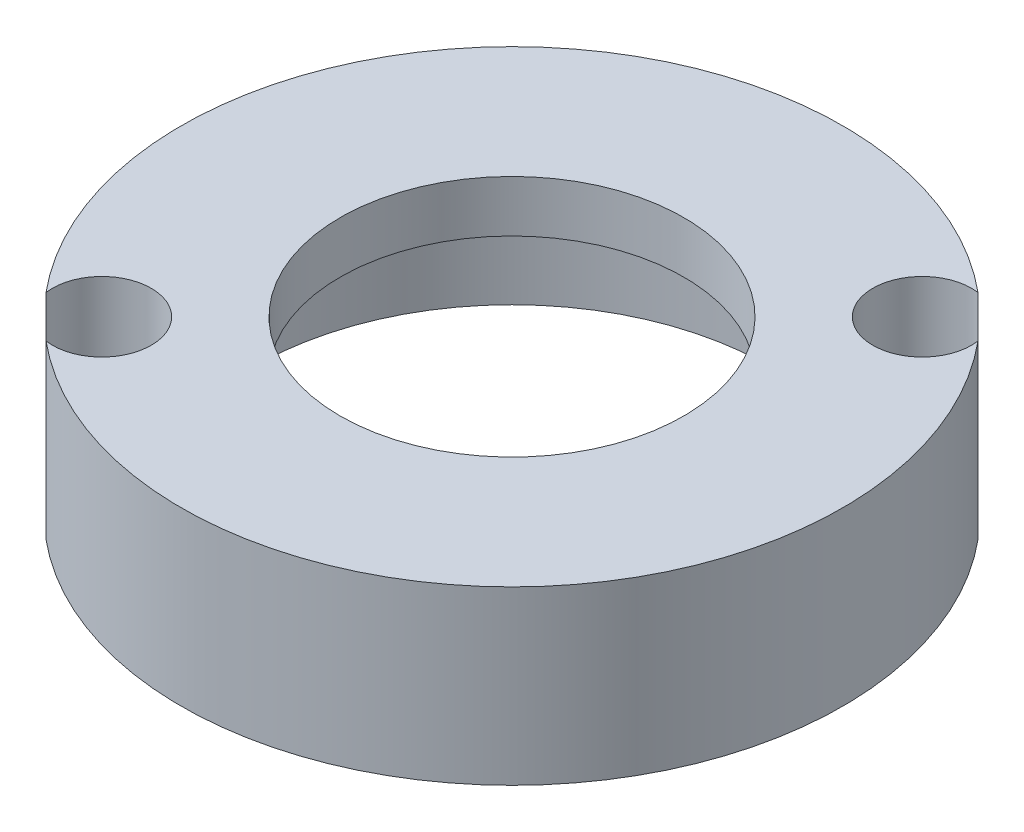
ISO-10303-21;
HEADER;
FILE_DESCRIPTION(('STEP AP214'),'2;1');
FILE_NAME('part.step','',(''),(''),'','','');
FILE_SCHEMA(('AUTOMOTIVE_DESIGN { 1 0 10303 214 1 1 1 1 }'));
ENDSEC;
DATA;
#1=APPLICATION_CONTEXT('core data for automotive mechanical design processes');
#2=APPLICATION_PROTOCOL_DEFINITION('international standard','automotive_design',2000,#1);
#3=PRODUCT_CONTEXT('',#1,'mechanical');
#4=PRODUCT('Part','Part','',(#3));
#5=PRODUCT_RELATED_PRODUCT_CATEGORY('part','',(#4));
#6=PRODUCT_DEFINITION_FORMATION('','',#4);
#7=PRODUCT_DEFINITION_CONTEXT('part definition',#1,'design');
#8=PRODUCT_DEFINITION('design','',#6,#7);
#9=PRODUCT_DEFINITION_SHAPE('','',#8);
#10=(LENGTH_UNIT() NAMED_UNIT(*) SI_UNIT(.MILLI.,.METRE.));
#11=(NAMED_UNIT(*) PLANE_ANGLE_UNIT() SI_UNIT($,.RADIAN.));
#12=(NAMED_UNIT(*) SI_UNIT($,.STERADIAN.) SOLID_ANGLE_UNIT());
#13=UNCERTAINTY_MEASURE_WITH_UNIT(LENGTH_MEASURE(1.E-05),#10,'distance_accuracy_value','');
#14=(GEOMETRIC_REPRESENTATION_CONTEXT(3) GLOBAL_UNCERTAINTY_ASSIGNED_CONTEXT((#13)) GLOBAL_UNIT_ASSIGNED_CONTEXT((#10,
#11,#12)) REPRESENTATION_CONTEXT('',''));
#15=CARTESIAN_POINT('',(0.,0.,0.));
#16=DIRECTION('',(0.,0.,1.));
#17=DIRECTION('',(1.,0.,0.));
#18=AXIS2_PLACEMENT_3D('',#15,#16,#17);
#19=CARTESIAN_POINT('',(0.,0.,0.));
#20=DIRECTION('',(0.,1.,0.));
#21=DIRECTION('',(0.,0.,1.));
#22=AXIS2_PLACEMENT_3D('',#19,#20,#21);
#23=PLANE('',#22);
#24=CARTESIAN_POINT('',(0.,0.,0.));
#25=DIRECTION('',(0.,-1.,0.));
#26=DIRECTION('',(0.,0.,-1.));
#27=AXIS2_PLACEMENT_3D('',#24,#25,#26);
#28=CIRCLE('',#27,6.);
#29=CARTESIAN_POINT('',(4.78265484035535,0.,-3.62301154814963));
#30=VERTEX_POINT('',#29);
#31=CARTESIAN_POINT('',(-3.62301154814961,0.,4.78265484035536));
#32=VERTEX_POINT('',#31);
#33=EDGE_CURVE('E112',#30,#32,#28,.T.);
#34=ORIENTED_EDGE('',*,*,#33,.F.);
#35=CARTESIAN_POINT('',(4.77297077300918,0.,-4.77297077300921));
#36=DIRECTION('',(0.,1.,0.));
#37=DIRECTION('',(0.,0.,1.));
#38=AXIS2_PLACEMENT_3D('',#35,#36,#37);
#39=CIRCLE('',#38,1.15);
#40=CARTESIAN_POINT('',(5.91167282869287,0.,-4.93377384630613));
#41=VERTEX_POINT('',#40);
#42=EDGE_CURVE('E150',#30,#41,#39,.T.);
#43=ORIENTED_EDGE('',*,*,#42,.T.);
#44=CARTESIAN_POINT('',(0.,0.,0.));
#45=DIRECTION('',(0.,1.,0.));
#46=DIRECTION('',(0.,0.,1.));
#47=AXIS2_PLACEMENT_3D('',#44,#45,#46);
#48=CIRCLE('',#47,7.7);
#49=CARTESIAN_POINT('',(-4.93377384630611,0.,5.9116728286929));
#50=VERTEX_POINT('',#49);
#51=EDGE_CURVE('E114',#50,#41,#48,.T.);
#52=ORIENTED_EDGE('',*,*,#51,.F.);
#53=CARTESIAN_POINT('',(-4.77297077300919,0.,4.7729707730092));
#54=DIRECTION('',(0.,1.,0.));
#55=DIRECTION('',(0.,0.,1.));
#56=AXIS2_PLACEMENT_3D('',#53,#54,#55);
#57=CIRCLE('',#56,1.15);
#58=EDGE_CURVE('E99',#50,#32,#57,.T.);
#59=ORIENTED_EDGE('',*,*,#58,.T.);
#60=EDGE_LOOP('',(#34,#43,#52,#59));
#61=FACE_BOUND('',#60,.T.);
#62=ADVANCED_FACE('F34',(#61),#23,.F.);
#63=CARTESIAN_POINT('',(0.,4.,0.));
#64=DIRECTION('',(0.,-1.,0.));
#65=DIRECTION('',(0.,0.,-1.));
#66=AXIS2_PLACEMENT_3D('',#63,#64,#65);
#67=CYLINDRICAL_SURFACE('',#66,7.7);
#68=ORIENTED_EDGE('',*,*,#51,.T.);
#69=DIRECTION('',(0.,1.,0.));
#70=VECTOR('',#69,1.);
#71=CARTESIAN_POINT('',(5.91167282869287,2.,-4.93377384630614));
#72=LINE('',#71,#70);
#73=CARTESIAN_POINT('',(5.91167282869287,4.,-4.93377384630613));
#74=VERTEX_POINT('',#73);
#75=EDGE_CURVE('E125',#41,#74,#72,.T.);
#76=ORIENTED_EDGE('',*,*,#75,.T.);
#77=CARTESIAN_POINT('',(0.,4.,0.));
#78=DIRECTION('',(0.,1.,0.));
#79=DIRECTION('',(0.,0.,1.));
#80=AXIS2_PLACEMENT_3D('',#77,#78,#79);
#81=CIRCLE('',#80,7.7);
#82=CARTESIAN_POINT('',(-4.93377384630611,4.,5.9116728286929));
#83=VERTEX_POINT('',#82);
#84=EDGE_CURVE('E133',#83,#74,#81,.T.);
#85=ORIENTED_EDGE('',*,*,#84,.F.);
#86=DIRECTION('',(0.,1.,0.));
#87=VECTOR('',#86,1.);
#88=CARTESIAN_POINT('',(-4.93377384630611,2.,5.9116728286929));
#89=LINE('',#88,#87);
#90=EDGE_CURVE('E149',#83,#50,#89,.F.);
#91=ORIENTED_EDGE('',*,*,#90,.T.);
#92=EDGE_LOOP('',(#68,#76,#85,#91));
#93=FACE_BOUND('',#92,.T.);
#94=ADVANCED_FACE('F169',(#93),#67,.T.);
#95=CARTESIAN_POINT('',(0.,20.9705627484771,0.));
#96=DIRECTION('',(0.,-1.,0.));
#97=DIRECTION('',(0.,0.,-1.));
#98=AXIS2_PLACEMENT_3D('',#95,#96,#97);
#99=CYLINDRICAL_SURFACE('',#98,6.);
#100=CARTESIAN_POINT('',(0.,2.8,0.));
#101=DIRECTION('',(0.,1.,0.));
#102=DIRECTION('',(0.,0.,1.));
#103=AXIS2_PLACEMENT_3D('',#100,#101,#102);
#104=CIRCLE('',#103,6.);
#105=CARTESIAN_POINT('',(4.78265484035535,2.8,-3.62301154814963));
#106=VERTEX_POINT('',#105);
#107=CARTESIAN_POINT('',(-3.62301154814961,2.8,4.78265484035536));
#108=VERTEX_POINT('',#107);
#109=EDGE_CURVE('E119',#106,#108,#104,.F.);
#110=ORIENTED_EDGE('',*,*,#109,.F.);
#111=DIRECTION('',(0.,1.,0.));
#112=VECTOR('',#111,1.);
#113=CARTESIAN_POINT('',(4.78265484035535,2.,-3.62301154814963));
#114=LINE('',#113,#112);
#115=EDGE_CURVE('E12',#106,#30,#114,.F.);
#116=ORIENTED_EDGE('',*,*,#115,.T.);
#117=ORIENTED_EDGE('',*,*,#33,.T.);
#118=DIRECTION('',(0.,1.,0.));
#119=VECTOR('',#118,1.);
#120=CARTESIAN_POINT('',(-3.62301154814961,2.,4.78265484035536));
#121=LINE('',#120,#119);
#122=EDGE_CURVE('E96',#32,#108,#121,.T.);
#123=ORIENTED_EDGE('',*,*,#122,.T.);
#124=EDGE_LOOP('',(#110,#116,#117,#123));
#125=FACE_BOUND('',#124,.T.);
#126=ADVANCED_FACE('F118',(#125),#99,.F.);
#127=CARTESIAN_POINT('',(0.,4.,0.));
#128=DIRECTION('',(0.,1.,0.));
#129=DIRECTION('',(0.,0.,1.));
#130=AXIS2_PLACEMENT_3D('',#127,#128,#129);
#131=PLANE('',#130);
#132=CARTESIAN_POINT('',(4.77297077300918,4.,-4.77297077300921));
#133=DIRECTION('',(0.,1.,0.));
#134=DIRECTION('',(0.,0.,1.));
#135=AXIS2_PLACEMENT_3D('',#132,#133,#134);
#136=CIRCLE('',#135,1.15);
#137=CARTESIAN_POINT('',(4.9337738463061,4.,-5.9116728286929));
#138=VERTEX_POINT('',#137);
#139=EDGE_CURVE('E176',#138,#74,#136,.T.);
#140=ORIENTED_EDGE('',*,*,#139,.F.);
#141=CARTESIAN_POINT('',(-5.91167282869288,4.,4.93377384630613));
#142=VERTEX_POINT('',#141);
#143=EDGE_CURVE('E106',#138,#142,#81,.T.);
#144=ORIENTED_EDGE('',*,*,#143,.T.);
#145=CARTESIAN_POINT('',(-4.77297077300919,4.,4.7729707730092));
#146=DIRECTION('',(0.,1.,0.));
#147=DIRECTION('',(0.,0.,1.));
#148=AXIS2_PLACEMENT_3D('',#145,#146,#147);
#149=CIRCLE('',#148,1.15);
#150=EDGE_CURVE('E116',#83,#142,#149,.T.);
#151=ORIENTED_EDGE('',*,*,#150,.F.);
#152=ORIENTED_EDGE('',*,*,#84,.T.);
#153=EDGE_LOOP('',(#140,#144,#151,#152));
#154=FACE_BOUND('',#153,.T.);
#155=CARTESIAN_POINT('',(0.,4.,0.));
#156=DIRECTION('',(0.,1.,0.));
#157=DIRECTION('',(0.,0.,1.));
#158=AXIS2_PLACEMENT_3D('',#155,#156,#157);
#159=CIRCLE('',#158,4.);
#160=CARTESIAN_POINT('',(0.,4.,4.));
#161=VERTEX_POINT('',#160);
#162=EDGE_CURVE('E129',#161,#161,#159,.T.);
#163=ORIENTED_EDGE('',*,*,#162,.F.);
#164=EDGE_LOOP('',(#163));
#165=FACE_BOUND('',#164,.T.);
#166=ADVANCED_FACE('F173',(#154,#165),#131,.T.);
#167=CARTESIAN_POINT('',(4.9337738463061,0.,-5.9116728286929));
#168=VERTEX_POINT('',#167);
#169=CARTESIAN_POINT('',(-5.91167282869288,0.,4.93377384630613));
#170=VERTEX_POINT('',#169);
#171=EDGE_CURVE('E136',#168,#170,#48,.T.);
#172=ORIENTED_EDGE('',*,*,#171,.F.);
#173=CARTESIAN_POINT('',(3.62301154814961,0.,-4.78265484035536));
#174=VERTEX_POINT('',#173);
#175=EDGE_CURVE('E154',#168,#174,#39,.T.);
#176=ORIENTED_EDGE('',*,*,#175,.T.);
#177=CARTESIAN_POINT('',(-4.78265484035535,0.,3.62301154814963));
#178=VERTEX_POINT('',#177);
#179=EDGE_CURVE('E120',#178,#174,#28,.T.);
#180=ORIENTED_EDGE('',*,*,#179,.F.);
#181=EDGE_CURVE('E115',#178,#170,#57,.T.);
#182=ORIENTED_EDGE('',*,*,#181,.T.);
#183=EDGE_LOOP('',(#172,#176,#180,#182));
#184=FACE_BOUND('',#183,.T.);
#185=ADVANCED_FACE('F179',(#184),#23,.F.);
#186=ORIENTED_EDGE('',*,*,#143,.F.);
#187=DIRECTION('',(0.,1.,0.));
#188=VECTOR('',#187,1.);
#189=CARTESIAN_POINT('',(4.93377384630611,2.,-5.9116728286929));
#190=LINE('',#189,#188);
#191=EDGE_CURVE('E160',#138,#168,#190,.F.);
#192=ORIENTED_EDGE('',*,*,#191,.T.);
#193=ORIENTED_EDGE('',*,*,#171,.T.);
#194=DIRECTION('',(0.,1.,0.));
#195=VECTOR('',#194,1.);
#196=CARTESIAN_POINT('',(-5.91167282869288,2.,4.93377384630613));
#197=LINE('',#196,#195);
#198=EDGE_CURVE('E152',#170,#142,#197,.T.);
#199=ORIENTED_EDGE('',*,*,#198,.T.);
#200=EDGE_LOOP('',(#186,#192,#193,#199));
#201=FACE_BOUND('',#200,.T.);
#202=ADVANCED_FACE('F36',(#201),#67,.T.);
#203=CARTESIAN_POINT('',(0.,4.,0.));
#204=DIRECTION('',(0.,-1.,0.));
#205=DIRECTION('',(0.,0.,-1.));
#206=AXIS2_PLACEMENT_3D('',#203,#204,#205);
#207=CYLINDRICAL_SURFACE('',#206,4.);
#208=CARTESIAN_POINT('',(0.,2.8,0.));
#209=DIRECTION('',(0.,1.,0.));
#210=DIRECTION('',(0.,0.,1.));
#211=AXIS2_PLACEMENT_3D('',#208,#209,#210);
#212=CIRCLE('',#211,4.);
#213=CARTESIAN_POINT('',(0.,2.8,4.));
#214=VERTEX_POINT('',#213);
#215=EDGE_CURVE('E132',#214,#214,#212,.T.);
#216=ORIENTED_EDGE('',*,*,#215,.F.);
#217=EDGE_LOOP('',(#216));
#218=FACE_BOUND('',#217,.T.);
#219=ORIENTED_EDGE('',*,*,#162,.T.);
#220=EDGE_LOOP('',(#219));
#221=FACE_BOUND('',#220,.T.);
#222=ADVANCED_FACE('F198',(#218,#221),#207,.F.);
#223=CARTESIAN_POINT('',(0.,2.8,0.));
#224=DIRECTION('',(0.,1.,0.));
#225=DIRECTION('',(0.,0.,1.));
#226=AXIS2_PLACEMENT_3D('',#223,#224,#225);
#227=PLANE('',#226);
#228=ORIENTED_EDGE('',*,*,#215,.T.);
#229=EDGE_LOOP('',(#228));
#230=FACE_BOUND('',#229,.T.);
#231=CARTESIAN_POINT('',(-4.78265484035535,2.8,3.62301154814963));
#232=VERTEX_POINT('',#231);
#233=CARTESIAN_POINT('',(3.62301154814961,2.8,-4.78265484035536));
#234=VERTEX_POINT('',#233);
#235=EDGE_CURVE('E122',#232,#234,#104,.F.);
#236=ORIENTED_EDGE('',*,*,#235,.T.);
#237=CARTESIAN_POINT('',(4.77297077300918,2.8,-4.77297077300921));
#238=DIRECTION('',(0.,1.,0.));
#239=DIRECTION('',(0.,0.,1.));
#240=AXIS2_PLACEMENT_3D('',#237,#238,#239);
#241=CIRCLE('',#240,1.15);
#242=EDGE_CURVE('E49',#234,#106,#241,.T.);
#243=ORIENTED_EDGE('',*,*,#242,.T.);
#244=ORIENTED_EDGE('',*,*,#109,.T.);
#245=CARTESIAN_POINT('',(-4.77297077300919,2.8,4.7729707730092));
#246=DIRECTION('',(0.,1.,0.));
#247=DIRECTION('',(0.,0.,1.));
#248=AXIS2_PLACEMENT_3D('',#245,#246,#247);
#249=CIRCLE('',#248,1.15);
#250=EDGE_CURVE('E57',#108,#232,#249,.T.);
#251=ORIENTED_EDGE('',*,*,#250,.T.);
#252=EDGE_LOOP('',(#236,#243,#244,#251));
#253=FACE_BOUND('',#252,.T.);
#254=ADVANCED_FACE('F148',(#230,#253),#227,.F.);
#255=ORIENTED_EDGE('',*,*,#179,.T.);
#256=DIRECTION('',(0.,1.,0.));
#257=VECTOR('',#256,1.);
#258=CARTESIAN_POINT('',(3.62301154814961,2.,-4.78265484035536));
#259=LINE('',#258,#257);
#260=EDGE_CURVE('E42',#174,#234,#259,.T.);
#261=ORIENTED_EDGE('',*,*,#260,.T.);
#262=ORIENTED_EDGE('',*,*,#235,.F.);
#263=DIRECTION('',(0.,1.,0.));
#264=VECTOR('',#263,1.);
#265=CARTESIAN_POINT('',(-4.78265484035535,2.,3.62301154814963));
#266=LINE('',#265,#264);
#267=EDGE_CURVE('E105',#232,#178,#266,.F.);
#268=ORIENTED_EDGE('',*,*,#267,.T.);
#269=EDGE_LOOP('',(#255,#261,#262,#268));
#270=FACE_BOUND('',#269,.T.);
#271=ADVANCED_FACE('F144',(#270),#99,.F.);
#272=CARTESIAN_POINT('',(-4.77297077300919,0.,4.7729707730092));
#273=DIRECTION('',(0.,1.,0.));
#274=DIRECTION('',(0.,0.,1.));
#275=AXIS2_PLACEMENT_3D('',#272,#273,#274);
#276=CYLINDRICAL_SURFACE('',#275,1.15);
#277=ORIENTED_EDGE('',*,*,#181,.F.);
#278=ORIENTED_EDGE('',*,*,#267,.F.);
#279=ORIENTED_EDGE('',*,*,#250,.F.);
#280=ORIENTED_EDGE('',*,*,#122,.F.);
#281=ORIENTED_EDGE('',*,*,#58,.F.);
#282=ORIENTED_EDGE('',*,*,#90,.F.);
#283=ORIENTED_EDGE('',*,*,#150,.T.);
#284=ORIENTED_EDGE('',*,*,#198,.F.);
#285=EDGE_LOOP('',(#277,#278,#279,#280,#281,#282,#283,#284));
#286=FACE_BOUND('',#285,.T.);
#287=ADVANCED_FACE('F98',(#286),#276,.F.);
#288=CARTESIAN_POINT('',(4.77297077300918,0.,-4.77297077300921));
#289=DIRECTION('',(0.,1.,0.));
#290=DIRECTION('',(0.,0.,1.));
#291=AXIS2_PLACEMENT_3D('',#288,#289,#290);
#292=CYLINDRICAL_SURFACE('',#291,1.15);
#293=ORIENTED_EDGE('',*,*,#42,.F.);
#294=ORIENTED_EDGE('',*,*,#115,.F.);
#295=ORIENTED_EDGE('',*,*,#242,.F.);
#296=ORIENTED_EDGE('',*,*,#260,.F.);
#297=ORIENTED_EDGE('',*,*,#175,.F.);
#298=ORIENTED_EDGE('',*,*,#191,.F.);
#299=ORIENTED_EDGE('',*,*,#139,.T.);
#300=ORIENTED_EDGE('',*,*,#75,.F.);
#301=EDGE_LOOP('',(#293,#294,#295,#296,#297,#298,#299,#300));
#302=FACE_BOUND('',#301,.T.);
#303=ADVANCED_FACE('F181',(#302),#292,.F.);
#304=CLOSED_SHELL('',(#62,#94,#126,#166,#185,#202,#222,#254,#271,#287,#303));
#305=MANIFOLD_SOLID_BREP('B2',#304);
#306=ADVANCED_BREP_SHAPE_REPRESENTATION('',(#18,#305),#14);
#307=SHAPE_DEFINITION_REPRESENTATION(#9,#306);
ENDSEC;
END-ISO-10303-21;
